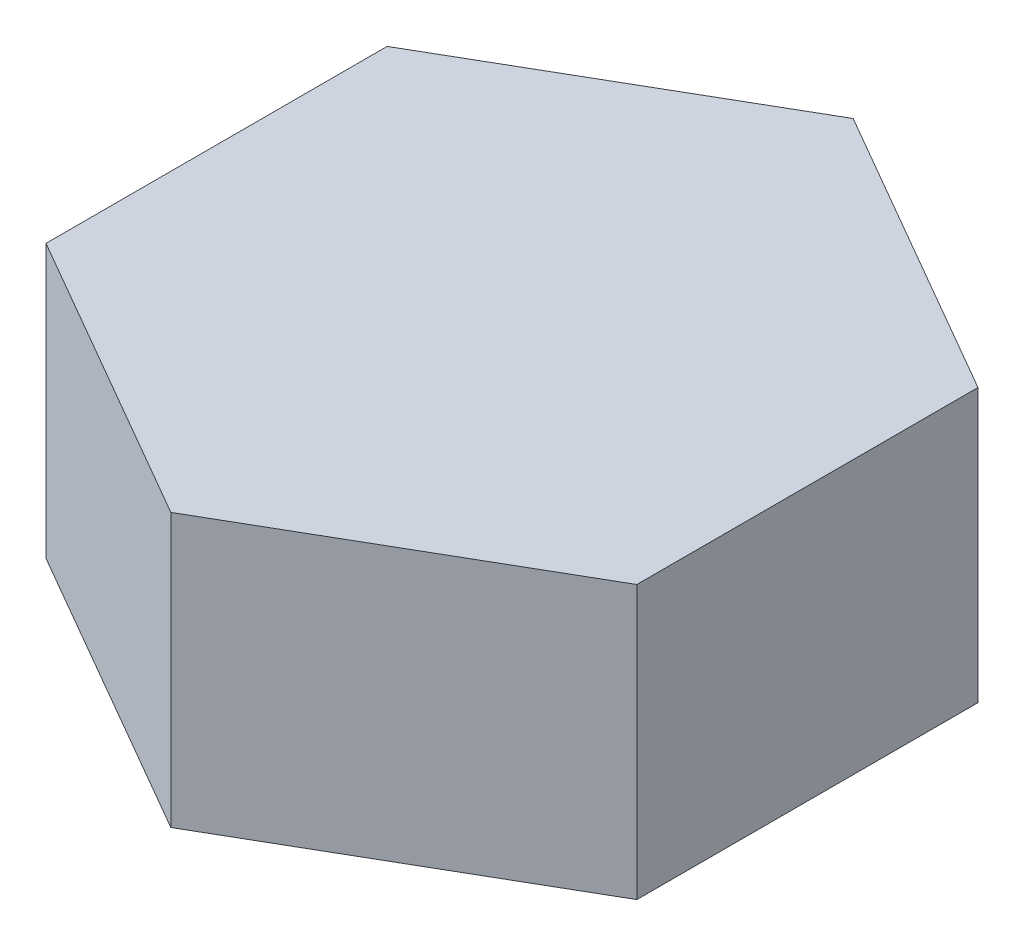
ISO-10303-21;
HEADER;
FILE_DESCRIPTION(('STEP AP214'),'2;1');
FILE_NAME('part.step','',(''),(''),'','','');
FILE_SCHEMA(('AUTOMOTIVE_DESIGN { 1 0 10303 214 1 1 1 1 }'));
ENDSEC;
DATA;
#1=APPLICATION_CONTEXT('core data for automotive mechanical design processes');
#2=APPLICATION_PROTOCOL_DEFINITION('international standard','automotive_design',2000,#1);
#3=PRODUCT_CONTEXT('',#1,'mechanical');
#4=PRODUCT('Part','Part','',(#3));
#5=PRODUCT_RELATED_PRODUCT_CATEGORY('part','',(#4));
#6=PRODUCT_DEFINITION_FORMATION('','',#4);
#7=PRODUCT_DEFINITION_CONTEXT('part definition',#1,'design');
#8=PRODUCT_DEFINITION('design','',#6,#7);
#9=PRODUCT_DEFINITION_SHAPE('','',#8);
#10=(LENGTH_UNIT() NAMED_UNIT(*) SI_UNIT(.MILLI.,.METRE.));
#11=(NAMED_UNIT(*) PLANE_ANGLE_UNIT() SI_UNIT($,.RADIAN.));
#12=(NAMED_UNIT(*) SI_UNIT($,.STERADIAN.) SOLID_ANGLE_UNIT());
#13=UNCERTAINTY_MEASURE_WITH_UNIT(LENGTH_MEASURE(1.E-05),#10,'distance_accuracy_value','');
#14=(GEOMETRIC_REPRESENTATION_CONTEXT(3) GLOBAL_UNCERTAINTY_ASSIGNED_CONTEXT((#13)) GLOBAL_UNIT_ASSIGNED_CONTEXT((#10,
#11,#12)) REPRESENTATION_CONTEXT('',''));
#15=CARTESIAN_POINT('',(0.,0.,0.));
#16=DIRECTION('',(0.,0.,1.));
#17=DIRECTION('',(1.,0.,0.));
#18=AXIS2_PLACEMENT_3D('',#15,#16,#17);
#19=CARTESIAN_POINT('',(21.6506350946108,20.,-12.5000000000003));
#20=DIRECTION('',(-0.499999999999995,0.,0.866025403784442));
#21=DIRECTION('',(0.866025403784442,0.,0.499999999999995));
#22=AXIS2_PLACEMENT_3D('',#19,#20,#21);
#23=PLANE('',#22);
#24=DIRECTION('',(-0.866025403784442,0.,-0.499999999999995));
#25=VECTOR('',#24,1.);
#26=CARTESIAN_POINT('',(21.6506350946108,0.,-12.5000000000003));
#27=LINE('',#26,#25);
#28=CARTESIAN_POINT('',(21.6506350946108,0.,-12.5000000000003));
#29=VERTEX_POINT('',#28);
#30=CARTESIAN_POINT('',(0.,0.,-25.));
#31=VERTEX_POINT('',#30);
#32=EDGE_CURVE('E119',#29,#31,#27,.T.);
#33=ORIENTED_EDGE('',*,*,#32,.T.);
#34=DIRECTION('',(0.,-1.,0.));
#35=VECTOR('',#34,1.);
#36=CARTESIAN_POINT('',(0.,20.,-25.));
#37=LINE('',#36,#35);
#38=CARTESIAN_POINT('',(0.,20.,-25.));
#39=VERTEX_POINT('',#38);
#40=EDGE_CURVE('E11',#39,#31,#37,.T.);
#41=ORIENTED_EDGE('',*,*,#40,.F.);
#42=DIRECTION('',(-0.866025403784442,0.,-0.499999999999995));
#43=VECTOR('',#42,1.);
#44=CARTESIAN_POINT('',(21.6506350946108,20.,-12.5000000000003));
#45=LINE('',#44,#43);
#46=CARTESIAN_POINT('',(21.6506350946108,20.,-12.5000000000003));
#47=VERTEX_POINT('',#46);
#48=EDGE_CURVE('E129',#47,#39,#45,.T.);
#49=ORIENTED_EDGE('',*,*,#48,.F.);
#50=DIRECTION('',(0.,-1.,0.));
#51=VECTOR('',#50,1.);
#52=CARTESIAN_POINT('',(21.6506350946108,20.,-12.5000000000003));
#53=LINE('',#52,#51);
#54=EDGE_CURVE('E115',#47,#29,#53,.T.);
#55=ORIENTED_EDGE('',*,*,#54,.T.);
#56=EDGE_LOOP('',(#33,#41,#49,#55));
#57=FACE_BOUND('',#56,.T.);
#58=ADVANCED_FACE('F35',(#57),#23,.F.);
#59=CARTESIAN_POINT('',(0.,20.,-25.));
#60=DIRECTION('',(0.500000000000001,0.,0.866025403784438));
#61=DIRECTION('',(0.866025403784438,0.,-0.500000000000001));
#62=AXIS2_PLACEMENT_3D('',#59,#60,#61);
#63=PLANE('',#62);
#64=DIRECTION('',(-0.866025403784438,0.,0.500000000000001));
#65=VECTOR('',#64,1.);
#66=CARTESIAN_POINT('',(0.,0.,-25.));
#67=LINE('',#66,#65);
#68=CARTESIAN_POINT('',(-21.650635094611,0.,-12.5));
#69=VERTEX_POINT('',#68);
#70=EDGE_CURVE('E122',#31,#69,#67,.T.);
#71=ORIENTED_EDGE('',*,*,#70,.T.);
#72=DIRECTION('',(0.,-1.,0.));
#73=VECTOR('',#72,1.);
#74=CARTESIAN_POINT('',(-21.650635094611,20.,-12.5));
#75=LINE('',#74,#73);
#76=CARTESIAN_POINT('',(-21.650635094611,20.,-12.5));
#77=VERTEX_POINT('',#76);
#78=EDGE_CURVE('E43',#77,#69,#75,.T.);
#79=ORIENTED_EDGE('',*,*,#78,.F.);
#80=DIRECTION('',(-0.866025403784438,0.,0.500000000000001));
#81=VECTOR('',#80,1.);
#82=CARTESIAN_POINT('',(0.,20.,-25.));
#83=LINE('',#82,#81);
#84=EDGE_CURVE('E88',#39,#77,#83,.T.);
#85=ORIENTED_EDGE('',*,*,#84,.F.);
#86=ORIENTED_EDGE('',*,*,#40,.T.);
#87=EDGE_LOOP('',(#71,#79,#85,#86));
#88=FACE_BOUND('',#87,.T.);
#89=ADVANCED_FACE('F153',(#88),#63,.F.);
#90=CARTESIAN_POINT('',(-21.650635094611,20.,-12.5));
#91=DIRECTION('',(1.,0.,0.));
#92=DIRECTION('',(0.,0.,-1.));
#93=AXIS2_PLACEMENT_3D('',#90,#91,#92);
#94=PLANE('',#93);
#95=DIRECTION('',(0.,0.,1.));
#96=VECTOR('',#95,1.);
#97=CARTESIAN_POINT('',(-21.650635094611,0.,-12.5));
#98=LINE('',#97,#96);
#99=CARTESIAN_POINT('',(-21.6506350946109,0.,12.5000000000001));
#100=VERTEX_POINT('',#99);
#101=EDGE_CURVE('E124',#69,#100,#98,.T.);
#102=ORIENTED_EDGE('',*,*,#101,.T.);
#103=DIRECTION('',(0.,-1.,0.));
#104=VECTOR('',#103,1.);
#105=CARTESIAN_POINT('',(-21.6506350946109,20.,12.5000000000001));
#106=LINE('',#105,#104);
#107=CARTESIAN_POINT('',(-21.6506350946109,20.,12.5000000000001));
#108=VERTEX_POINT('',#107);
#109=EDGE_CURVE('E110',#108,#100,#106,.T.);
#110=ORIENTED_EDGE('',*,*,#109,.F.);
#111=DIRECTION('',(0.,0.,1.));
#112=VECTOR('',#111,1.);
#113=CARTESIAN_POINT('',(-21.650635094611,20.,-12.5));
#114=LINE('',#113,#112);
#115=EDGE_CURVE('E101',#77,#108,#114,.T.);
#116=ORIENTED_EDGE('',*,*,#115,.F.);
#117=ORIENTED_EDGE('',*,*,#78,.T.);
#118=EDGE_LOOP('',(#102,#110,#116,#117));
#119=FACE_BOUND('',#118,.T.);
#120=ADVANCED_FACE('F135',(#119),#94,.F.);
#121=CARTESIAN_POINT('',(-21.6506350946109,20.,12.5000000000001));
#122=DIRECTION('',(0.499999999999995,0.,-0.866025403784442));
#123=DIRECTION('',(-0.866025403784442,0.,-0.499999999999995));
#124=AXIS2_PLACEMENT_3D('',#121,#122,#123);
#125=PLANE('',#124);
#126=DIRECTION('',(0.866025403784442,0.,0.499999999999995));
#127=VECTOR('',#126,1.);
#128=CARTESIAN_POINT('',(-21.6506350946109,0.,12.5000000000001));
#129=LINE('',#128,#127);
#130=CARTESIAN_POINT('',(1.73043258443222E-13,0.,25.));
#131=VERTEX_POINT('',#130);
#132=EDGE_CURVE('E109',#100,#131,#129,.T.);
#133=ORIENTED_EDGE('',*,*,#132,.T.);
#134=DIRECTION('',(0.,-1.,0.));
#135=VECTOR('',#134,1.);
#136=CARTESIAN_POINT('',(1.73043258443222E-13,20.,25.));
#137=LINE('',#136,#135);
#138=CARTESIAN_POINT('',(1.73043258443222E-13,20.,25.));
#139=VERTEX_POINT('',#138);
#140=EDGE_CURVE('E106',#139,#131,#137,.T.);
#141=ORIENTED_EDGE('',*,*,#140,.F.);
#142=DIRECTION('',(0.866025403784442,0.,0.499999999999995));
#143=VECTOR('',#142,1.);
#144=CARTESIAN_POINT('',(-21.6506350946109,20.,12.5000000000001));
#145=LINE('',#144,#143);
#146=EDGE_CURVE('E95',#108,#139,#145,.T.);
#147=ORIENTED_EDGE('',*,*,#146,.F.);
#148=ORIENTED_EDGE('',*,*,#109,.T.);
#149=EDGE_LOOP('',(#133,#141,#147,#148));
#150=FACE_BOUND('',#149,.T.);
#151=ADVANCED_FACE('F107',(#150),#125,.F.);
#152=CARTESIAN_POINT('',(1.73043258443222E-13,20.,25.));
#153=DIRECTION('',(-0.500000000000007,0.,-0.866025403784435));
#154=DIRECTION('',(-0.866025403784435,0.,0.500000000000007));
#155=AXIS2_PLACEMENT_3D('',#152,#153,#154);
#156=PLANE('',#155);
#157=DIRECTION('',(0.866025403784435,0.,-0.500000000000007));
#158=VECTOR('',#157,1.);
#159=CARTESIAN_POINT('',(1.73043258443222E-13,0.,25.));
#160=LINE('',#159,#158);
#161=CARTESIAN_POINT('',(21.6506350946111,0.,12.4999999999998));
#162=VERTEX_POINT('',#161);
#163=EDGE_CURVE('E74',#131,#162,#160,.T.);
#164=ORIENTED_EDGE('',*,*,#163,.T.);
#165=DIRECTION('',(0.,-1.,0.));
#166=VECTOR('',#165,1.);
#167=CARTESIAN_POINT('',(21.6506350946111,20.,12.4999999999998));
#168=LINE('',#167,#166);
#169=CARTESIAN_POINT('',(21.6506350946111,20.,12.4999999999998));
#170=VERTEX_POINT('',#169);
#171=EDGE_CURVE('E111',#170,#162,#168,.T.);
#172=ORIENTED_EDGE('',*,*,#171,.F.);
#173=DIRECTION('',(0.866025403784435,0.,-0.500000000000007));
#174=VECTOR('',#173,1.);
#175=CARTESIAN_POINT('',(1.73043258443222E-13,20.,25.));
#176=LINE('',#175,#174);
#177=EDGE_CURVE('E99',#139,#170,#176,.T.);
#178=ORIENTED_EDGE('',*,*,#177,.F.);
#179=ORIENTED_EDGE('',*,*,#140,.T.);
#180=EDGE_LOOP('',(#164,#172,#178,#179));
#181=FACE_BOUND('',#180,.T.);
#182=ADVANCED_FACE('F113',(#181),#156,.F.);
#183=CARTESIAN_POINT('',(21.6506350946111,20.,12.4999999999998));
#184=DIRECTION('',(-1.,0.,0.));
#185=DIRECTION('',(0.,0.,1.));
#186=AXIS2_PLACEMENT_3D('',#183,#184,#185);
#187=PLANE('',#186);
#188=DIRECTION('',(0.,0.,-1.));
#189=VECTOR('',#188,1.);
#190=CARTESIAN_POINT('',(21.6506350946111,0.,12.4999999999998));
#191=LINE('',#190,#189);
#192=EDGE_CURVE('E80',#162,#29,#191,.T.);
#193=ORIENTED_EDGE('',*,*,#192,.T.);
#194=ORIENTED_EDGE('',*,*,#54,.F.);
#195=DIRECTION('',(0.,0.,-1.));
#196=VECTOR('',#195,1.);
#197=CARTESIAN_POINT('',(21.6506350946111,20.,12.4999999999998));
#198=LINE('',#197,#196);
#199=EDGE_CURVE('E51',#170,#47,#198,.T.);
#200=ORIENTED_EDGE('',*,*,#199,.F.);
#201=ORIENTED_EDGE('',*,*,#171,.T.);
#202=EDGE_LOOP('',(#193,#194,#200,#201));
#203=FACE_BOUND('',#202,.T.);
#204=ADVANCED_FACE('F142',(#203),#187,.F.);
#205=CARTESIAN_POINT('',(0.,20.,0.));
#206=DIRECTION('',(0.,1.,0.));
#207=DIRECTION('',(0.,0.,1.));
#208=AXIS2_PLACEMENT_3D('',#205,#206,#207);
#209=PLANE('',#208);
#210=ORIENTED_EDGE('',*,*,#48,.T.);
#211=ORIENTED_EDGE('',*,*,#84,.T.);
#212=ORIENTED_EDGE('',*,*,#115,.T.);
#213=ORIENTED_EDGE('',*,*,#146,.T.);
#214=ORIENTED_EDGE('',*,*,#177,.T.);
#215=ORIENTED_EDGE('',*,*,#199,.T.);
#216=EDGE_LOOP('',(#210,#211,#212,#213,#214,#215));
#217=FACE_BOUND('',#216,.T.);
#218=ADVANCED_FACE('F97',(#217),#209,.T.);
#219=CARTESIAN_POINT('',(0.,0.,0.));
#220=DIRECTION('',(0.,1.,0.));
#221=DIRECTION('',(0.,0.,1.));
#222=AXIS2_PLACEMENT_3D('',#219,#220,#221);
#223=PLANE('',#222);
#224=ORIENTED_EDGE('',*,*,#32,.F.);
#225=ORIENTED_EDGE('',*,*,#192,.F.);
#226=ORIENTED_EDGE('',*,*,#163,.F.);
#227=ORIENTED_EDGE('',*,*,#132,.F.);
#228=ORIENTED_EDGE('',*,*,#101,.F.);
#229=ORIENTED_EDGE('',*,*,#70,.F.);
#230=EDGE_LOOP('',(#224,#225,#226,#227,#228,#229));
#231=FACE_BOUND('',#230,.T.);
#232=ADVANCED_FACE('F138',(#231),#223,.F.);
#233=CLOSED_SHELL('',(#58,#89,#120,#151,#182,#204,#218,#232));
#234=MANIFOLD_SOLID_BREP('B2',#233);
#235=ADVANCED_BREP_SHAPE_REPRESENTATION('',(#18,#234),#14);
#236=SHAPE_DEFINITION_REPRESENTATION(#9,#235);
ENDSEC;
END-ISO-10303-21;
